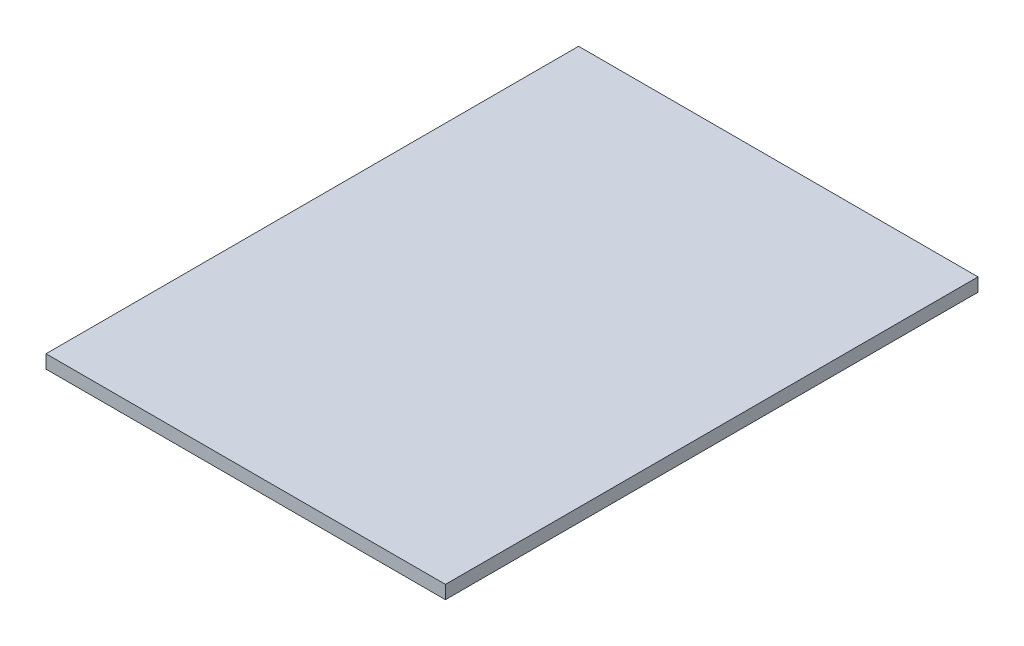
ISO-10303-21;
HEADER;
FILE_DESCRIPTION(('STEP AP214'),'2;1');
FILE_NAME('part.step','',(''),(''),'','','');
FILE_SCHEMA(('AUTOMOTIVE_DESIGN { 1 0 10303 214 1 1 1 1 }'));
ENDSEC;
DATA;
#1=APPLICATION_CONTEXT('core data for automotive mechanical design processes');
#2=APPLICATION_PROTOCOL_DEFINITION('international standard','automotive_design',2000,#1);
#3=PRODUCT_CONTEXT('',#1,'mechanical');
#4=PRODUCT('Part','Part','',(#3));
#5=PRODUCT_RELATED_PRODUCT_CATEGORY('part','',(#4));
#6=PRODUCT_DEFINITION_FORMATION('','',#4);
#7=PRODUCT_DEFINITION_CONTEXT('part definition',#1,'design');
#8=PRODUCT_DEFINITION('design','',#6,#7);
#9=PRODUCT_DEFINITION_SHAPE('','',#8);
#10=(LENGTH_UNIT() NAMED_UNIT(*) SI_UNIT(.MILLI.,.METRE.));
#11=(NAMED_UNIT(*) PLANE_ANGLE_UNIT() SI_UNIT($,.RADIAN.));
#12=(NAMED_UNIT(*) SI_UNIT($,.STERADIAN.) SOLID_ANGLE_UNIT());
#13=UNCERTAINTY_MEASURE_WITH_UNIT(LENGTH_MEASURE(1.E-05),#10,'distance_accuracy_value','');
#14=(GEOMETRIC_REPRESENTATION_CONTEXT(3) GLOBAL_UNCERTAINTY_ASSIGNED_CONTEXT((#13)) GLOBAL_UNIT_ASSIGNED_CONTEXT((#10,
#11,#12)) REPRESENTATION_CONTEXT('',''));
#15=CARTESIAN_POINT('',(0.,0.,0.));
#16=DIRECTION('',(0.,0.,1.));
#17=DIRECTION('',(1.,0.,0.));
#18=AXIS2_PLACEMENT_3D('',#15,#16,#17);
#19=CARTESIAN_POINT('',(180.,2.,0.));
#20=DIRECTION('',(-1.,0.,0.));
#21=DIRECTION('',(0.,0.,1.));
#22=AXIS2_PLACEMENT_3D('',#19,#20,#21);
#23=PLANE('',#22);
#24=DIRECTION('',(0.,1.,0.));
#25=VECTOR('',#24,1.);
#26=CARTESIAN_POINT('',(180.,2.,40.));
#27=LINE('',#26,#25);
#28=CARTESIAN_POINT('',(180.,1.,40.));
#29=VERTEX_POINT('',#28);
#30=CARTESIAN_POINT('',(180.,2.,40.));
#31=VERTEX_POINT('',#30);
#32=EDGE_CURVE('E11',#29,#31,#27,.T.);
#33=ORIENTED_EDGE('',*,*,#32,.F.);
#34=DIRECTION('',(0.,0.,1.));
#35=VECTOR('',#34,1.);
#36=CARTESIAN_POINT('',(180.,1.,0.));
#37=LINE('',#36,#35);
#38=CARTESIAN_POINT('',(180.,1.,0.));
#39=VERTEX_POINT('',#38);
#40=EDGE_CURVE('E88',#29,#39,#37,.F.);
#41=ORIENTED_EDGE('',*,*,#40,.T.);
#42=DIRECTION('',(0.,1.,0.));
#43=VECTOR('',#42,1.);
#44=CARTESIAN_POINT('',(180.,2.,0.));
#45=LINE('',#44,#43);
#46=CARTESIAN_POINT('',(180.,2.,0.));
#47=VERTEX_POINT('',#46);
#48=EDGE_CURVE('E43',#39,#47,#45,.T.);
#49=ORIENTED_EDGE('',*,*,#48,.T.);
#50=DIRECTION('',(0.,0.,1.));
#51=VECTOR('',#50,1.);
#52=CARTESIAN_POINT('',(180.,2.,0.));
#53=LINE('',#52,#51);
#54=EDGE_CURVE('E101',#31,#47,#53,.F.);
#55=ORIENTED_EDGE('',*,*,#54,.F.);
#56=EDGE_LOOP('',(#33,#41,#49,#55));
#57=FACE_BOUND('',#56,.T.);
#58=ADVANCED_FACE('F33',(#57),#23,.F.);
#59=CARTESIAN_POINT('',(0.,2.,0.));
#60=DIRECTION('',(0.,0.,1.));
#61=DIRECTION('',(1.,0.,0.));
#62=AXIS2_PLACEMENT_3D('',#59,#60,#61);
#63=PLANE('',#62);
#64=ORIENTED_EDGE('',*,*,#48,.F.);
#65=DIRECTION('',(1.,0.,0.));
#66=VECTOR('',#65,1.);
#67=CARTESIAN_POINT('',(0.,1.,0.));
#68=LINE('',#67,#66);
#69=CARTESIAN_POINT('',(150.,1.,0.));
#70=VERTEX_POINT('',#69);
#71=EDGE_CURVE('E95',#39,#70,#68,.F.);
#72=ORIENTED_EDGE('',*,*,#71,.T.);
#73=DIRECTION('',(0.,1.,0.));
#74=VECTOR('',#73,1.);
#75=CARTESIAN_POINT('',(150.,2.,0.));
#76=LINE('',#75,#74);
#77=CARTESIAN_POINT('',(150.,2.,0.));
#78=VERTEX_POINT('',#77);
#79=EDGE_CURVE('E51',#70,#78,#76,.T.);
#80=ORIENTED_EDGE('',*,*,#79,.T.);
#81=DIRECTION('',(1.,0.,0.));
#82=VECTOR('',#81,1.);
#83=CARTESIAN_POINT('',(0.,2.,0.));
#84=LINE('',#83,#82);
#85=EDGE_CURVE('E82',#47,#78,#84,.F.);
#86=ORIENTED_EDGE('',*,*,#85,.F.);
#87=EDGE_LOOP('',(#64,#72,#80,#86));
#88=FACE_BOUND('',#87,.T.);
#89=ADVANCED_FACE('F105',(#88),#63,.F.);
#90=CARTESIAN_POINT('',(150.,2.,0.));
#91=DIRECTION('',(-1.,0.,0.));
#92=DIRECTION('',(0.,0.,1.));
#93=AXIS2_PLACEMENT_3D('',#90,#91,#92);
#94=PLANE('',#93);
#95=ORIENTED_EDGE('',*,*,#79,.F.);
#96=DIRECTION('',(0.,0.,1.));
#97=VECTOR('',#96,1.);
#98=CARTESIAN_POINT('',(150.,1.,0.));
#99=LINE('',#98,#97);
#100=CARTESIAN_POINT('',(150.,1.,40.));
#101=VERTEX_POINT('',#100);
#102=EDGE_CURVE('E87',#101,#70,#99,.F.);
#103=ORIENTED_EDGE('',*,*,#102,.F.);
#104=DIRECTION('',(0.,1.,0.));
#105=VECTOR('',#104,1.);
#106=CARTESIAN_POINT('',(150.,2.,40.));
#107=LINE('',#106,#105);
#108=CARTESIAN_POINT('',(150.,2.,40.));
#109=VERTEX_POINT('',#108);
#110=EDGE_CURVE('E37',#101,#109,#107,.T.);
#111=ORIENTED_EDGE('',*,*,#110,.T.);
#112=DIRECTION('',(0.,0.,1.));
#113=VECTOR('',#112,1.);
#114=CARTESIAN_POINT('',(150.,2.,0.));
#115=LINE('',#114,#113);
#116=EDGE_CURVE('E97',#109,#78,#115,.F.);
#117=ORIENTED_EDGE('',*,*,#116,.T.);
#118=EDGE_LOOP('',(#95,#103,#111,#117));
#119=FACE_BOUND('',#118,.T.);
#120=ADVANCED_FACE('F90',(#119),#94,.T.);
#121=CARTESIAN_POINT('',(0.,2.,40.));
#122=DIRECTION('',(0.,0.,1.));
#123=DIRECTION('',(1.,0.,0.));
#124=AXIS2_PLACEMENT_3D('',#121,#122,#123);
#125=PLANE('',#124);
#126=DIRECTION('',(1.,0.,0.));
#127=VECTOR('',#126,1.);
#128=CARTESIAN_POINT('',(0.,1.,40.));
#129=LINE('',#128,#127);
#130=EDGE_CURVE('E76',#101,#29,#129,.T.);
#131=ORIENTED_EDGE('',*,*,#130,.T.);
#132=ORIENTED_EDGE('',*,*,#32,.T.);
#133=DIRECTION('',(1.,0.,0.));
#134=VECTOR('',#133,1.);
#135=CARTESIAN_POINT('',(0.,2.,40.));
#136=LINE('',#135,#134);
#137=EDGE_CURVE('E78',#109,#31,#136,.T.);
#138=ORIENTED_EDGE('',*,*,#137,.F.);
#139=ORIENTED_EDGE('',*,*,#110,.F.);
#140=EDGE_LOOP('',(#131,#132,#138,#139));
#141=FACE_BOUND('',#140,.T.);
#142=ADVANCED_FACE('F35',(#141),#125,.T.);
#143=CARTESIAN_POINT('',(0.,2.,0.));
#144=DIRECTION('',(0.,1.,0.));
#145=DIRECTION('',(0.,0.,1.));
#146=AXIS2_PLACEMENT_3D('',#143,#144,#145);
#147=PLANE('',#146);
#148=ORIENTED_EDGE('',*,*,#116,.F.);
#149=ORIENTED_EDGE('',*,*,#137,.T.);
#150=ORIENTED_EDGE('',*,*,#54,.T.);
#151=ORIENTED_EDGE('',*,*,#85,.T.);
#152=EDGE_LOOP('',(#148,#149,#150,#151));
#153=FACE_BOUND('',#152,.T.);
#154=ADVANCED_FACE('F104',(#153),#147,.T.);
#155=CARTESIAN_POINT('',(0.,1.,0.));
#156=DIRECTION('',(0.,1.,0.));
#157=DIRECTION('',(0.,0.,1.));
#158=AXIS2_PLACEMENT_3D('',#155,#156,#157);
#159=PLANE('',#158);
#160=ORIENTED_EDGE('',*,*,#102,.T.);
#161=ORIENTED_EDGE('',*,*,#71,.F.);
#162=ORIENTED_EDGE('',*,*,#40,.F.);
#163=ORIENTED_EDGE('',*,*,#130,.F.);
#164=EDGE_LOOP('',(#160,#161,#162,#163));
#165=FACE_BOUND('',#164,.T.);
#166=ADVANCED_FACE('F85',(#165),#159,.F.);
#167=CLOSED_SHELL('',(#58,#89,#120,#142,#154,#166));
#168=MANIFOLD_SOLID_BREP('B2',#167);
#169=ADVANCED_BREP_SHAPE_REPRESENTATION('',(#18,#168),#14);
#170=SHAPE_DEFINITION_REPRESENTATION(#9,#169);
ENDSEC;
END-ISO-10303-21;
